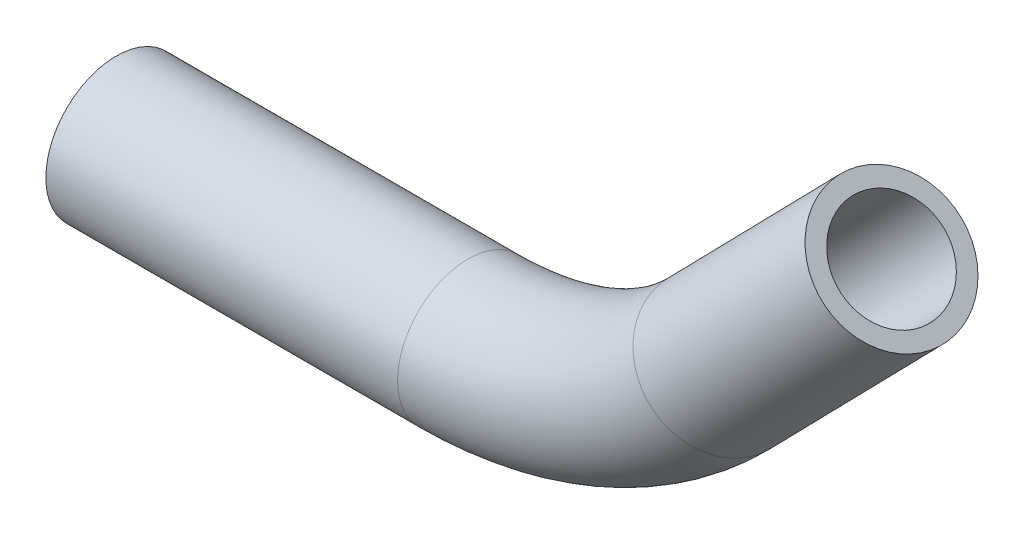
ISO-10303-21;
HEADER;
FILE_DESCRIPTION(('STEP AP214'),'2;1');
FILE_NAME('part.step','',(''),(''),'','','');
FILE_SCHEMA(('AUTOMOTIVE_DESIGN { 1 0 10303 214 1 1 1 1 }'));
ENDSEC;
DATA;
#1=APPLICATION_CONTEXT('core data for automotive mechanical design processes');
#2=APPLICATION_PROTOCOL_DEFINITION('international standard','automotive_design',2000,#1);
#3=PRODUCT_CONTEXT('',#1,'mechanical');
#4=PRODUCT('Part','Part','',(#3));
#5=PRODUCT_RELATED_PRODUCT_CATEGORY('part','',(#4));
#6=PRODUCT_DEFINITION_FORMATION('','',#4);
#7=PRODUCT_DEFINITION_CONTEXT('part definition',#1,'design');
#8=PRODUCT_DEFINITION('design','',#6,#7);
#9=PRODUCT_DEFINITION_SHAPE('','',#8);
#10=(LENGTH_UNIT() NAMED_UNIT(*) SI_UNIT(.MILLI.,.METRE.));
#11=(NAMED_UNIT(*) PLANE_ANGLE_UNIT() SI_UNIT($,.RADIAN.));
#12=(NAMED_UNIT(*) SI_UNIT($,.STERADIAN.) SOLID_ANGLE_UNIT());
#13=UNCERTAINTY_MEASURE_WITH_UNIT(LENGTH_MEASURE(1.E-05),#10,'distance_accuracy_value','');
#14=(GEOMETRIC_REPRESENTATION_CONTEXT(3) GLOBAL_UNCERTAINTY_ASSIGNED_CONTEXT((#13)) GLOBAL_UNIT_ASSIGNED_CONTEXT((#10,
#11,#12)) REPRESENTATION_CONTEXT('',''));
#15=CARTESIAN_POINT('',(0.,0.,0.));
#16=DIRECTION('',(0.,0.,1.));
#17=DIRECTION('',(1.,0.,0.));
#18=AXIS2_PLACEMENT_3D('',#15,#16,#17);
#19=CARTESIAN_POINT('',(0.,0.,0.));
#20=DIRECTION('',(1.,0.,0.));
#21=DIRECTION('',(0.,0.,-1.));
#22=AXIS2_PLACEMENT_3D('',#19,#20,#21);
#23=CYLINDRICAL_SURFACE('',#22,4.);
#24=CARTESIAN_POINT('',(20.,0.,0.));
#25=DIRECTION('',(1.,0.,0.));
#26=DIRECTION('',(0.,0.,-1.));
#27=AXIS2_PLACEMENT_3D('',#24,#25,#26);
#28=CIRCLE('',#27,4.);
#29=CARTESIAN_POINT('',(20.,-4.,0.));
#30=VERTEX_POINT('',#29);
#31=EDGE_CURVE('E56',#30,#30,#28,.T.);
#32=ORIENTED_EDGE('',*,*,#31,.F.);
#33=EDGE_LOOP('',(#32));
#34=FACE_BOUND('',#33,.T.);
#35=CARTESIAN_POINT('',(0.,0.,0.));
#36=DIRECTION('',(1.,0.,0.));
#37=DIRECTION('',(0.,0.,-1.));
#38=AXIS2_PLACEMENT_3D('',#35,#36,#37);
#39=CIRCLE('',#38,4.);
#40=CARTESIAN_POINT('',(0.,0.,-4.));
#41=VERTEX_POINT('',#40);
#42=EDGE_CURVE('E54',#41,#41,#39,.T.);
#43=ORIENTED_EDGE('',*,*,#42,.T.);
#44=EDGE_LOOP('',(#43));
#45=FACE_BOUND('',#44,.T.);
#46=ADVANCED_FACE('F33',(#34,#45),#23,.T.);
#47=CARTESIAN_POINT('',(20.,20.,0.));
#48=DIRECTION('',(0.,0.,1.));
#49=DIRECTION('',(1.,0.,0.));
#50=AXIS2_PLACEMENT_3D('',#47,#48,#49);
#51=TOROIDAL_SURFACE('',#50,20.,4.);
#52=CARTESIAN_POINT('',(34.3073626832568,6.02504479256727,0.));
#53=DIRECTION('',(0.698747760371636,0.71536813416284,0.));
#54=DIRECTION('',(0.,0.,-1.));
#55=AXIS2_PLACEMENT_3D('',#52,#53,#54);
#56=CIRCLE('',#55,4.);
#57=CARTESIAN_POINT('',(37.1688352199082,3.23005375108073,0.));
#58=VERTEX_POINT('',#57);
#59=EDGE_CURVE('E37',#58,#58,#56,.T.);
#60=CARTESIAN_POINT('',(20.,20.,0.));
#61=DIRECTION('',(0.,0.,1.));
#62=DIRECTION('',(1.,0.,0.));
#63=AXIS2_PLACEMENT_3D('',#60,#61,#62);
#64=CIRCLE('',#63,24.);
#65=EDGE_CURVE('',#30,#58,#64,.T.);
#66=ORIENTED_EDGE('',*,*,#31,.T.);
#67=ORIENTED_EDGE('',*,*,#59,.F.);
#68=ORIENTED_EDGE('',*,*,#65,.T.);
#69=ORIENTED_EDGE('',*,*,#65,.F.);
#70=EDGE_LOOP('',(#66,#68,#67,#69));
#71=FACE_BOUND('',#70,.T.);
#72=ADVANCED_FACE('F64',(#71),#51,.T.);
#73=CARTESIAN_POINT('',(34.3073626832568,6.02504479256727,0.));
#74=DIRECTION('',(0.698747760371636,0.71536813416284,0.));
#75=DIRECTION('',(-0.71536813416284,0.698747760371636,0.));
#76=AXIS2_PLACEMENT_3D('',#73,#74,#75);
#77=CYLINDRICAL_SURFACE('',#76,4.);
#78=CARTESIAN_POINT('',(44.0898313284597,16.040198670847,0.));
#79=DIRECTION('',(0.698747760371636,0.71536813416284,0.));
#80=DIRECTION('',(0.,0.,-1.));
#81=AXIS2_PLACEMENT_3D('',#78,#79,#80);
#82=CIRCLE('',#81,4.);
#83=CARTESIAN_POINT('',(44.0898313284597,16.040198670847,-4.));
#84=VERTEX_POINT('',#83);
#85=EDGE_CURVE('E50',#84,#84,#82,.T.);
#86=ORIENTED_EDGE('',*,*,#85,.F.);
#87=EDGE_LOOP('',(#86));
#88=FACE_BOUND('',#87,.T.);
#89=ORIENTED_EDGE('',*,*,#59,.T.);
#90=EDGE_LOOP('',(#89));
#91=FACE_BOUND('',#90,.T.);
#92=ADVANCED_FACE('F35',(#88,#91),#77,.T.);
#93=CARTESIAN_POINT('',(0.,0.,0.));
#94=DIRECTION('',(1.,0.,0.));
#95=DIRECTION('',(0.,0.,-1.));
#96=AXIS2_PLACEMENT_3D('',#93,#94,#95);
#97=PLANE('',#96);
#98=CARTESIAN_POINT('',(0.,0.,0.));
#99=DIRECTION('',(1.,0.,0.));
#100=DIRECTION('',(0.,0.,-1.));
#101=AXIS2_PLACEMENT_3D('',#98,#99,#100);
#102=CIRCLE('',#101,3.);
#103=CARTESIAN_POINT('',(0.,0.,-3.));
#104=VERTEX_POINT('',#103);
#105=EDGE_CURVE('E53',#104,#104,#102,.F.);
#106=ORIENTED_EDGE('',*,*,#105,.F.);
#107=EDGE_LOOP('',(#106));
#108=FACE_BOUND('',#107,.T.);
#109=ORIENTED_EDGE('',*,*,#42,.F.);
#110=EDGE_LOOP('',(#109));
#111=FACE_BOUND('',#110,.T.);
#112=ADVANCED_FACE('F70',(#108,#111),#97,.F.);
#113=CARTESIAN_POINT('',(44.0898313284597,16.040198670847,0.));
#114=DIRECTION('',(0.698747760371636,0.71536813416284,0.));
#115=DIRECTION('',(0.,0.,-1.));
#116=AXIS2_PLACEMENT_3D('',#113,#114,#115);
#117=PLANE('',#116);
#118=CARTESIAN_POINT('',(44.0898313284597,16.040198670847,0.));
#119=DIRECTION('',(0.698747760371636,0.71536813416284,0.));
#120=DIRECTION('',(0.,0.,-1.));
#121=AXIS2_PLACEMENT_3D('',#118,#119,#120);
#122=CIRCLE('',#121,3.);
#123=CARTESIAN_POINT('',(44.0898313284597,16.040198670847,-3.));
#124=VERTEX_POINT('',#123);
#125=EDGE_CURVE('E10',#124,#124,#122,.F.);
#126=ORIENTED_EDGE('',*,*,#125,.T.);
#127=EDGE_LOOP('',(#126));
#128=FACE_BOUND('',#127,.T.);
#129=ORIENTED_EDGE('',*,*,#85,.T.);
#130=EDGE_LOOP('',(#129));
#131=FACE_BOUND('',#130,.T.);
#132=ADVANCED_FACE('F88',(#128,#131),#117,.T.);
#133=CARTESIAN_POINT('',(0.,0.,0.));
#134=DIRECTION('',(1.,0.,0.));
#135=DIRECTION('',(0.,0.,-1.));
#136=AXIS2_PLACEMENT_3D('',#133,#134,#135);
#137=CYLINDRICAL_SURFACE('',#136,3.);
#138=CARTESIAN_POINT('',(20.,0.,0.));
#139=DIRECTION('',(1.,0.,0.));
#140=DIRECTION('',(0.,0.,-1.));
#141=AXIS2_PLACEMENT_3D('',#138,#139,#140);
#142=CIRCLE('',#141,3.);
#143=CARTESIAN_POINT('',(20.,-3.,0.));
#144=VERTEX_POINT('',#143);
#145=EDGE_CURVE('E46',#144,#144,#142,.F.);
#146=ORIENTED_EDGE('',*,*,#145,.F.);
#147=EDGE_LOOP('',(#146));
#148=FACE_BOUND('',#147,.T.);
#149=ORIENTED_EDGE('',*,*,#105,.T.);
#150=EDGE_LOOP('',(#149));
#151=FACE_BOUND('',#150,.T.);
#152=ADVANCED_FACE('F82',(#148,#151),#137,.F.);
#153=CARTESIAN_POINT('',(20.,20.,0.));
#154=DIRECTION('',(0.,0.,1.));
#155=DIRECTION('',(1.,0.,0.));
#156=AXIS2_PLACEMENT_3D('',#153,#154,#155);
#157=TOROIDAL_SURFACE('',#156,20.,3.);
#158=CARTESIAN_POINT('',(34.3073626832568,6.02504479256727,0.));
#159=DIRECTION('',(0.698747760371636,0.71536813416284,0.));
#160=DIRECTION('',(0.,0.,-1.));
#161=AXIS2_PLACEMENT_3D('',#158,#159,#160);
#162=CIRCLE('',#161,3.);
#163=CARTESIAN_POINT('',(36.4534670857453,3.92880151145236,0.));
#164=VERTEX_POINT('',#163);
#165=EDGE_CURVE('E41',#164,#164,#162,.F.);
#166=CARTESIAN_POINT('',(20.,20.,0.));
#167=DIRECTION('',(0.,0.,1.));
#168=DIRECTION('',(1.,0.,0.));
#169=AXIS2_PLACEMENT_3D('',#166,#167,#168);
#170=CIRCLE('',#169,23.);
#171=EDGE_CURVE('',#144,#164,#170,.T.);
#172=ORIENTED_EDGE('',*,*,#145,.T.);
#173=ORIENTED_EDGE('',*,*,#165,.F.);
#174=ORIENTED_EDGE('',*,*,#171,.T.);
#175=ORIENTED_EDGE('',*,*,#171,.F.);
#176=EDGE_LOOP('',(#172,#174,#173,#175));
#177=FACE_BOUND('',#176,.T.);
#178=ADVANCED_FACE('F76',(#177),#157,.F.);
#179=CARTESIAN_POINT('',(34.3073626832568,6.02504479256727,0.));
#180=DIRECTION('',(0.698747760371636,0.71536813416284,0.));
#181=DIRECTION('',(-0.71536813416284,0.698747760371636,0.));
#182=AXIS2_PLACEMENT_3D('',#179,#180,#181);
#183=CYLINDRICAL_SURFACE('',#182,3.);
#184=ORIENTED_EDGE('',*,*,#125,.F.);
#185=EDGE_LOOP('',(#184));
#186=FACE_BOUND('',#185,.T.);
#187=ORIENTED_EDGE('',*,*,#165,.T.);
#188=EDGE_LOOP('',(#187));
#189=FACE_BOUND('',#188,.T.);
#190=ADVANCED_FACE('F74',(#186,#189),#183,.F.);
#191=CLOSED_SHELL('',(#46,#72,#92,#112,#132,#152,#178,#190));
#192=MANIFOLD_SOLID_BREP('B2',#191);
#193=ADVANCED_BREP_SHAPE_REPRESENTATION('',(#18,#192),#14);
#194=SHAPE_DEFINITION_REPRESENTATION(#9,#193);
ENDSEC;
END-ISO-10303-21;
